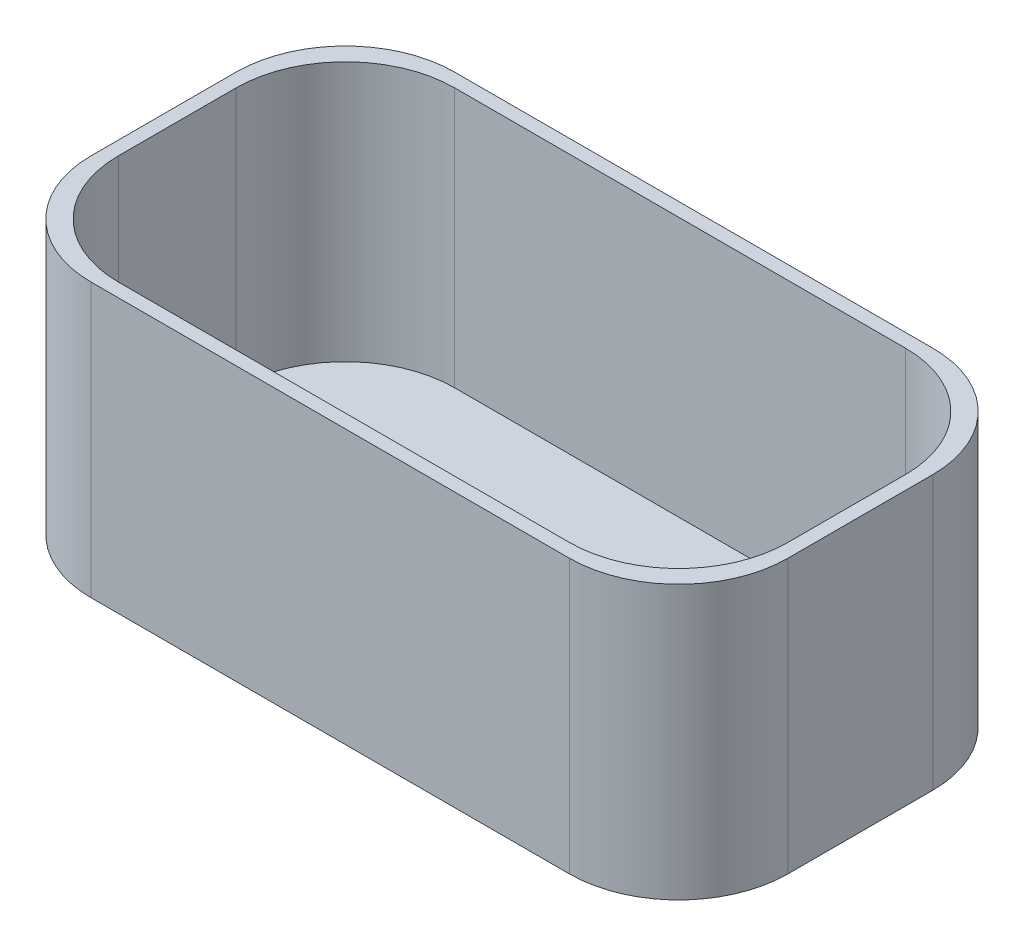
ISO-10303-21;
HEADER;
FILE_DESCRIPTION(('STEP AP214'),'2;1');
FILE_NAME('part.step','',(''),(''),'','','');
FILE_SCHEMA(('AUTOMOTIVE_DESIGN { 1 0 10303 214 1 1 1 1 }'));
ENDSEC;
DATA;
#1=APPLICATION_CONTEXT('core data for automotive mechanical design processes');
#2=APPLICATION_PROTOCOL_DEFINITION('international standard','automotive_design',2000,#1);
#3=PRODUCT_CONTEXT('',#1,'mechanical');
#4=PRODUCT('Part','Part','',(#3));
#5=PRODUCT_RELATED_PRODUCT_CATEGORY('part','',(#4));
#6=PRODUCT_DEFINITION_FORMATION('','',#4);
#7=PRODUCT_DEFINITION_CONTEXT('part definition',#1,'design');
#8=PRODUCT_DEFINITION('design','',#6,#7);
#9=PRODUCT_DEFINITION_SHAPE('','',#8);
#10=(LENGTH_UNIT() NAMED_UNIT(*) SI_UNIT(.MILLI.,.METRE.));
#11=(NAMED_UNIT(*) PLANE_ANGLE_UNIT() SI_UNIT($,.RADIAN.));
#12=(NAMED_UNIT(*) SI_UNIT($,.STERADIAN.) SOLID_ANGLE_UNIT());
#13=UNCERTAINTY_MEASURE_WITH_UNIT(LENGTH_MEASURE(1.E-05),#10,'distance_accuracy_value','');
#14=(GEOMETRIC_REPRESENTATION_CONTEXT(3) GLOBAL_UNCERTAINTY_ASSIGNED_CONTEXT((#13)) GLOBAL_UNIT_ASSIGNED_CONTEXT((#10,
#11,#12)) REPRESENTATION_CONTEXT('',''));
#15=CARTESIAN_POINT('',(0.,0.,0.));
#16=DIRECTION('',(0.,0.,1.));
#17=DIRECTION('',(1.,0.,0.));
#18=AXIS2_PLACEMENT_3D('',#15,#16,#17);
#19=CARTESIAN_POINT('',(127.45,100.,-66.5));
#20=DIRECTION('',(-1.,0.,0.));
#21=DIRECTION('',(0.,0.,1.));
#22=AXIS2_PLACEMENT_3D('',#19,#20,#21);
#23=PLANE('',#22);
#24=DIRECTION('',(0.,0.,-1.));
#25=VECTOR('',#24,1.);
#26=CARTESIAN_POINT('',(127.45,0.,-66.5));
#27=LINE('',#26,#25);
#28=CARTESIAN_POINT('',(127.45,0.,26.5));
#29=VERTEX_POINT('',#28);
#30=CARTESIAN_POINT('',(127.45,0.,-26.5));
#31=VERTEX_POINT('',#30);
#32=EDGE_CURVE('E223',#29,#31,#27,.T.);
#33=ORIENTED_EDGE('',*,*,#32,.T.);
#34=DIRECTION('',(0.,-1.,0.));
#35=VECTOR('',#34,1.);
#36=CARTESIAN_POINT('',(127.45,100.,-26.5));
#37=LINE('',#36,#35);
#38=CARTESIAN_POINT('',(127.45,100.,-26.5));
#39=VERTEX_POINT('',#38);
#40=EDGE_CURVE('E312',#31,#39,#37,.F.);
#41=ORIENTED_EDGE('',*,*,#40,.T.);
#42=DIRECTION('',(0.,0.,-1.));
#43=VECTOR('',#42,1.);
#44=CARTESIAN_POINT('',(127.45,100.,-66.5));
#45=LINE('',#44,#43);
#46=CARTESIAN_POINT('',(127.45,100.,26.5));
#47=VERTEX_POINT('',#46);
#48=EDGE_CURVE('E224',#47,#39,#45,.T.);
#49=ORIENTED_EDGE('',*,*,#48,.F.);
#50=DIRECTION('',(0.,-1.,0.));
#51=VECTOR('',#50,1.);
#52=CARTESIAN_POINT('',(127.45,100.,26.5));
#53=LINE('',#52,#51);
#54=EDGE_CURVE('E309',#47,#29,#53,.T.);
#55=ORIENTED_EDGE('',*,*,#54,.T.);
#56=EDGE_LOOP('',(#33,#41,#49,#55));
#57=FACE_BOUND('',#56,.T.);
#58=ADVANCED_FACE('F34',(#57),#23,.F.);
#59=CARTESIAN_POINT('',(-127.45,100.,-66.5));
#60=DIRECTION('',(0.,0.,1.));
#61=DIRECTION('',(1.,0.,0.));
#62=AXIS2_PLACEMENT_3D('',#59,#60,#61);
#63=PLANE('',#62);
#64=DIRECTION('',(-1.,0.,0.));
#65=VECTOR('',#64,1.);
#66=CARTESIAN_POINT('',(-127.45,0.,-66.5));
#67=LINE('',#66,#65);
#68=CARTESIAN_POINT('',(87.45,0.,-66.5));
#69=VERTEX_POINT('',#68);
#70=CARTESIAN_POINT('',(-87.45,0.,-66.5));
#71=VERTEX_POINT('',#70);
#72=EDGE_CURVE('E240',#69,#71,#67,.T.);
#73=ORIENTED_EDGE('',*,*,#72,.T.);
#74=DIRECTION('',(0.,-1.,0.));
#75=VECTOR('',#74,1.);
#76=CARTESIAN_POINT('',(-87.45,100.,-66.5));
#77=LINE('',#76,#75);
#78=CARTESIAN_POINT('',(-87.45,100.,-66.5));
#79=VERTEX_POINT('',#78);
#80=EDGE_CURVE('E299',#71,#79,#77,.F.);
#81=ORIENTED_EDGE('',*,*,#80,.T.);
#82=DIRECTION('',(-1.,0.,0.));
#83=VECTOR('',#82,1.);
#84=CARTESIAN_POINT('',(-127.45,100.,-66.5));
#85=LINE('',#84,#83);
#86=CARTESIAN_POINT('',(87.45,100.,-66.5));
#87=VERTEX_POINT('',#86);
#88=EDGE_CURVE('E227',#87,#79,#85,.T.);
#89=ORIENTED_EDGE('',*,*,#88,.F.);
#90=DIRECTION('',(0.,-1.,0.));
#91=VECTOR('',#90,1.);
#92=CARTESIAN_POINT('',(87.45,100.,-66.5));
#93=LINE('',#92,#91);
#94=EDGE_CURVE('E296',#87,#69,#93,.T.);
#95=ORIENTED_EDGE('',*,*,#94,.T.);
#96=EDGE_LOOP('',(#73,#81,#89,#95));
#97=FACE_BOUND('',#96,.T.);
#98=ADVANCED_FACE('F338',(#97),#63,.F.);
#99=CARTESIAN_POINT('',(-127.45,100.,-66.5));
#100=DIRECTION('',(1.,0.,0.));
#101=DIRECTION('',(0.,0.,-1.));
#102=AXIS2_PLACEMENT_3D('',#99,#100,#101);
#103=PLANE('',#102);
#104=DIRECTION('',(0.,0.,1.));
#105=VECTOR('',#104,1.);
#106=CARTESIAN_POINT('',(-127.45,100.,-66.5));
#107=LINE('',#106,#105);
#108=CARTESIAN_POINT('',(-127.45,100.,-26.5));
#109=VERTEX_POINT('',#108);
#110=CARTESIAN_POINT('',(-127.45,100.,26.5));
#111=VERTEX_POINT('',#110);
#112=EDGE_CURVE('E231',#109,#111,#107,.T.);
#113=ORIENTED_EDGE('',*,*,#112,.F.);
#114=DIRECTION('',(0.,-1.,0.));
#115=VECTOR('',#114,1.);
#116=CARTESIAN_POINT('',(-127.45,100.,-26.5));
#117=LINE('',#116,#115);
#118=CARTESIAN_POINT('',(-127.45,0.,-26.5));
#119=VERTEX_POINT('',#118);
#120=EDGE_CURVE('E285',#109,#119,#117,.T.);
#121=ORIENTED_EDGE('',*,*,#120,.T.);
#122=DIRECTION('',(0.,0.,1.));
#123=VECTOR('',#122,1.);
#124=CARTESIAN_POINT('',(-127.45,0.,-66.5));
#125=LINE('',#124,#123);
#126=CARTESIAN_POINT('',(-127.45,0.,26.5));
#127=VERTEX_POINT('',#126);
#128=EDGE_CURVE('E243',#119,#127,#125,.T.);
#129=ORIENTED_EDGE('',*,*,#128,.T.);
#130=DIRECTION('',(0.,-1.,0.));
#131=VECTOR('',#130,1.);
#132=CARTESIAN_POINT('',(-127.45,100.,26.5));
#133=LINE('',#132,#131);
#134=EDGE_CURVE('E283',#127,#111,#133,.F.);
#135=ORIENTED_EDGE('',*,*,#134,.T.);
#136=EDGE_LOOP('',(#113,#121,#129,#135));
#137=FACE_BOUND('',#136,.T.);
#138=ADVANCED_FACE('F344',(#137),#103,.F.);
#139=CARTESIAN_POINT('',(-127.45,100.,66.5));
#140=DIRECTION('',(0.,0.,-1.));
#141=DIRECTION('',(-1.,0.,0.));
#142=AXIS2_PLACEMENT_3D('',#139,#140,#141);
#143=PLANE('',#142);
#144=DIRECTION('',(1.,0.,0.));
#145=VECTOR('',#144,1.);
#146=CARTESIAN_POINT('',(-127.45,0.,66.5));
#147=LINE('',#146,#145);
#148=CARTESIAN_POINT('',(-87.45,0.,66.5));
#149=VERTEX_POINT('',#148);
#150=CARTESIAN_POINT('',(87.45,0.,66.5));
#151=VERTEX_POINT('',#150);
#152=EDGE_CURVE('E228',#149,#151,#147,.T.);
#153=ORIENTED_EDGE('',*,*,#152,.T.);
#154=DIRECTION('',(0.,-1.,0.));
#155=VECTOR('',#154,1.);
#156=CARTESIAN_POINT('',(87.45,100.,66.5));
#157=LINE('',#156,#155);
#158=CARTESIAN_POINT('',(87.45,100.,66.5));
#159=VERTEX_POINT('',#158);
#160=EDGE_CURVE('E317',#151,#159,#157,.F.);
#161=ORIENTED_EDGE('',*,*,#160,.T.);
#162=DIRECTION('',(1.,0.,0.));
#163=VECTOR('',#162,1.);
#164=CARTESIAN_POINT('',(-127.45,100.,66.5));
#165=LINE('',#164,#163);
#166=CARTESIAN_POINT('',(-87.45,100.,66.5));
#167=VERTEX_POINT('',#166);
#168=EDGE_CURVE('E234',#167,#159,#165,.T.);
#169=ORIENTED_EDGE('',*,*,#168,.F.);
#170=DIRECTION('',(0.,-1.,0.));
#171=VECTOR('',#170,1.);
#172=CARTESIAN_POINT('',(-87.45,100.,66.5));
#173=LINE('',#172,#171);
#174=EDGE_CURVE('E314',#167,#149,#173,.T.);
#175=ORIENTED_EDGE('',*,*,#174,.T.);
#176=EDGE_LOOP('',(#153,#161,#169,#175));
#177=FACE_BOUND('',#176,.T.);
#178=ADVANCED_FACE('F402',(#177),#143,.F.);
#179=CARTESIAN_POINT('',(0.,100.,0.));
#180=DIRECTION('',(0.,1.,0.));
#181=DIRECTION('',(0.,0.,1.));
#182=AXIS2_PLACEMENT_3D('',#179,#180,#181);
#183=PLANE('',#182);
#184=DIRECTION('',(0.,0.,-1.));
#185=VECTOR('',#184,1.);
#186=CARTESIAN_POINT('',(122.45,100.,-66.5));
#187=LINE('',#186,#185);
#188=CARTESIAN_POINT('',(122.45,100.,21.5));
#189=VERTEX_POINT('',#188);
#190=CARTESIAN_POINT('',(122.45,100.,-21.5));
#191=VERTEX_POINT('',#190);
#192=EDGE_CURVE('E211',#189,#191,#187,.T.);
#193=ORIENTED_EDGE('',*,*,#192,.F.);
#194=CARTESIAN_POINT('',(82.45,100.,21.5));
#195=DIRECTION('',(0.,1.,0.));
#196=DIRECTION('',(0.,0.,1.));
#197=AXIS2_PLACEMENT_3D('',#194,#195,#196);
#198=CIRCLE('',#197,40.);
#199=CARTESIAN_POINT('',(82.45,100.,61.5));
#200=VERTEX_POINT('',#199);
#201=EDGE_CURVE('E275',#189,#200,#198,.F.);
#202=ORIENTED_EDGE('',*,*,#201,.T.);
#203=DIRECTION('',(1.,0.,0.));
#204=VECTOR('',#203,1.);
#205=CARTESIAN_POINT('',(-127.45,100.,61.5));
#206=LINE('',#205,#204);
#207=CARTESIAN_POINT('',(-82.45,100.,61.5));
#208=VERTEX_POINT('',#207);
#209=EDGE_CURVE('E220',#208,#200,#206,.T.);
#210=ORIENTED_EDGE('',*,*,#209,.F.);
#211=CARTESIAN_POINT('',(-82.45,100.,21.5));
#212=DIRECTION('',(0.,1.,0.));
#213=DIRECTION('',(0.,0.,1.));
#214=AXIS2_PLACEMENT_3D('',#211,#212,#213);
#215=CIRCLE('',#214,40.);
#216=CARTESIAN_POINT('',(-122.45,100.,21.5));
#217=VERTEX_POINT('',#216);
#218=EDGE_CURVE('E281',#208,#217,#215,.F.);
#219=ORIENTED_EDGE('',*,*,#218,.T.);
#220=DIRECTION('',(0.,0.,1.));
#221=VECTOR('',#220,1.);
#222=CARTESIAN_POINT('',(-122.45,100.,-66.5));
#223=LINE('',#222,#221);
#224=CARTESIAN_POINT('',(-122.45,100.,-21.5));
#225=VERTEX_POINT('',#224);
#226=EDGE_CURVE('E217',#225,#217,#223,.T.);
#227=ORIENTED_EDGE('',*,*,#226,.F.);
#228=CARTESIAN_POINT('',(-82.45,100.,-21.5));
#229=DIRECTION('',(0.,1.,0.));
#230=DIRECTION('',(0.,0.,1.));
#231=AXIS2_PLACEMENT_3D('',#228,#229,#230);
#232=CIRCLE('',#231,40.);
#233=CARTESIAN_POINT('',(-82.45,100.,-61.5));
#234=VERTEX_POINT('',#233);
#235=EDGE_CURVE('E279',#225,#234,#232,.F.);
#236=ORIENTED_EDGE('',*,*,#235,.T.);
#237=DIRECTION('',(-1.,0.,0.));
#238=VECTOR('',#237,1.);
#239=CARTESIAN_POINT('',(-127.45,100.,-61.5));
#240=LINE('',#239,#238);
#241=CARTESIAN_POINT('',(82.45,100.,-61.5));
#242=VERTEX_POINT('',#241);
#243=EDGE_CURVE('E214',#242,#234,#240,.T.);
#244=ORIENTED_EDGE('',*,*,#243,.F.);
#245=CARTESIAN_POINT('',(82.45,100.,-21.5));
#246=DIRECTION('',(0.,1.,0.));
#247=DIRECTION('',(0.,0.,1.));
#248=AXIS2_PLACEMENT_3D('',#245,#246,#247);
#249=CIRCLE('',#248,40.);
#250=EDGE_CURVE('E277',#242,#191,#249,.F.);
#251=ORIENTED_EDGE('',*,*,#250,.T.);
#252=EDGE_LOOP('',(#193,#202,#210,#219,#227,#236,#244,#251));
#253=FACE_BOUND('',#252,.T.);
#254=ORIENTED_EDGE('',*,*,#88,.T.);
#255=CARTESIAN_POINT('',(-87.45,100.,-26.5));
#256=DIRECTION('',(0.,1.,0.));
#257=DIRECTION('',(0.,0.,1.));
#258=AXIS2_PLACEMENT_3D('',#255,#256,#257);
#259=CIRCLE('',#258,40.);
#260=EDGE_CURVE('E307',#79,#109,#259,.T.);
#261=ORIENTED_EDGE('',*,*,#260,.T.);
#262=ORIENTED_EDGE('',*,*,#112,.T.);
#263=CARTESIAN_POINT('',(-87.45,100.,26.5));
#264=DIRECTION('',(0.,1.,0.));
#265=DIRECTION('',(0.,0.,1.));
#266=AXIS2_PLACEMENT_3D('',#263,#264,#265);
#267=CIRCLE('',#266,40.);
#268=EDGE_CURVE('E301',#111,#167,#267,.T.);
#269=ORIENTED_EDGE('',*,*,#268,.T.);
#270=ORIENTED_EDGE('',*,*,#168,.T.);
#271=CARTESIAN_POINT('',(87.45,100.,26.5));
#272=DIRECTION('',(0.,1.,0.));
#273=DIRECTION('',(0.,0.,1.));
#274=AXIS2_PLACEMENT_3D('',#271,#272,#273);
#275=CIRCLE('',#274,40.);
#276=EDGE_CURVE('E303',#159,#47,#275,.T.);
#277=ORIENTED_EDGE('',*,*,#276,.T.);
#278=ORIENTED_EDGE('',*,*,#48,.T.);
#279=CARTESIAN_POINT('',(87.45,100.,-26.5));
#280=DIRECTION('',(0.,1.,0.));
#281=DIRECTION('',(0.,0.,1.));
#282=AXIS2_PLACEMENT_3D('',#279,#280,#281);
#283=CIRCLE('',#282,40.);
#284=EDGE_CURVE('E305',#39,#87,#283,.T.);
#285=ORIENTED_EDGE('',*,*,#284,.T.);
#286=EDGE_LOOP('',(#254,#261,#262,#269,#270,#277,#278,#285));
#287=FACE_BOUND('',#286,.T.);
#288=ADVANCED_FACE('F384',(#253,#287),#183,.T.);
#289=CARTESIAN_POINT('',(0.,0.,0.));
#290=DIRECTION('',(0.,1.,0.));
#291=DIRECTION('',(0.,0.,1.));
#292=AXIS2_PLACEMENT_3D('',#289,#290,#291);
#293=PLANE('',#292);
#294=DIRECTION('',(-1.,0.,0.));
#295=VECTOR('',#294,1.);
#296=CARTESIAN_POINT('',(0.,0.,-17.5));
#297=LINE('',#296,#295);
#298=CARTESIAN_POINT('',(25.,0.,-17.5));
#299=VERTEX_POINT('',#298);
#300=CARTESIAN_POINT('',(-25.,0.,-17.5));
#301=VERTEX_POINT('',#300);
#302=EDGE_CURVE('E42',#299,#301,#297,.T.);
#303=ORIENTED_EDGE('',*,*,#302,.T.);
#304=CARTESIAN_POINT('',(-25.,0.,0.));
#305=DIRECTION('',(0.,1.,0.));
#306=DIRECTION('',(0.,0.,1.));
#307=AXIS2_PLACEMENT_3D('',#304,#305,#306);
#308=CIRCLE('',#307,17.5);
#309=CARTESIAN_POINT('',(-25.,0.,17.5));
#310=VERTEX_POINT('',#309);
#311=EDGE_CURVE('E11',#301,#310,#308,.T.);
#312=ORIENTED_EDGE('',*,*,#311,.T.);
#313=DIRECTION('',(1.,0.,0.));
#314=VECTOR('',#313,1.);
#315=CARTESIAN_POINT('',(0.,0.,17.5));
#316=LINE('',#315,#314);
#317=CARTESIAN_POINT('',(25.,0.,17.5));
#318=VERTEX_POINT('',#317);
#319=EDGE_CURVE('E176',#310,#318,#316,.T.);
#320=ORIENTED_EDGE('',*,*,#319,.T.);
#321=CARTESIAN_POINT('',(25.,0.,0.));
#322=DIRECTION('',(0.,1.,0.));
#323=DIRECTION('',(0.,0.,1.));
#324=AXIS2_PLACEMENT_3D('',#321,#322,#323);
#325=CIRCLE('',#324,17.5);
#326=EDGE_CURVE('E320',#318,#299,#325,.T.);
#327=ORIENTED_EDGE('',*,*,#326,.T.);
#328=EDGE_LOOP('',(#303,#312,#320,#327));
#329=FACE_BOUND('',#328,.T.);
#330=ORIENTED_EDGE('',*,*,#128,.F.);
#331=CARTESIAN_POINT('',(-87.45,0.,-26.5));
#332=DIRECTION('',(0.,1.,0.));
#333=DIRECTION('',(0.,0.,1.));
#334=AXIS2_PLACEMENT_3D('',#331,#332,#333);
#335=CIRCLE('',#334,40.);
#336=EDGE_CURVE('E294',#119,#71,#335,.F.);
#337=ORIENTED_EDGE('',*,*,#336,.T.);
#338=ORIENTED_EDGE('',*,*,#72,.F.);
#339=CARTESIAN_POINT('',(87.45,0.,-26.5));
#340=DIRECTION('',(0.,1.,0.));
#341=DIRECTION('',(0.,0.,1.));
#342=AXIS2_PLACEMENT_3D('',#339,#340,#341);
#343=CIRCLE('',#342,40.);
#344=EDGE_CURVE('E292',#69,#31,#343,.F.);
#345=ORIENTED_EDGE('',*,*,#344,.T.);
#346=ORIENTED_EDGE('',*,*,#32,.F.);
#347=CARTESIAN_POINT('',(87.45,0.,26.5));
#348=DIRECTION('',(0.,1.,0.));
#349=DIRECTION('',(0.,0.,1.));
#350=AXIS2_PLACEMENT_3D('',#347,#348,#349);
#351=CIRCLE('',#350,40.);
#352=EDGE_CURVE('E290',#29,#151,#351,.F.);
#353=ORIENTED_EDGE('',*,*,#352,.T.);
#354=ORIENTED_EDGE('',*,*,#152,.F.);
#355=CARTESIAN_POINT('',(-87.45,0.,26.5));
#356=DIRECTION('',(0.,1.,0.));
#357=DIRECTION('',(0.,0.,1.));
#358=AXIS2_PLACEMENT_3D('',#355,#356,#357);
#359=CIRCLE('',#358,40.);
#360=EDGE_CURVE('E288',#149,#127,#359,.F.);
#361=ORIENTED_EDGE('',*,*,#360,.T.);
#362=EDGE_LOOP('',(#330,#337,#338,#345,#346,#353,#354,#361));
#363=FACE_BOUND('',#362,.T.);
#364=ADVANCED_FACE('F324',(#329,#363),#293,.F.);
#365=CARTESIAN_POINT('',(122.45,100.,-66.5));
#366=DIRECTION('',(-1.,0.,0.));
#367=DIRECTION('',(0.,0.,1.));
#368=AXIS2_PLACEMENT_3D('',#365,#366,#367);
#369=PLANE('',#368);
#370=DIRECTION('',(0.,0.,-1.));
#371=VECTOR('',#370,1.);
#372=CARTESIAN_POINT('',(122.45,5.,-66.5));
#373=LINE('',#372,#371);
#374=CARTESIAN_POINT('',(122.45,5.,21.5));
#375=VERTEX_POINT('',#374);
#376=CARTESIAN_POINT('',(122.45,5.,-21.5));
#377=VERTEX_POINT('',#376);
#378=EDGE_CURVE('E196',#375,#377,#373,.T.);
#379=ORIENTED_EDGE('',*,*,#378,.F.);
#380=DIRECTION('',(0.,-1.,0.));
#381=VECTOR('',#380,1.);
#382=CARTESIAN_POINT('',(122.45,100.,21.5));
#383=LINE('',#382,#381);
#384=EDGE_CURVE('E263',#375,#189,#383,.F.);
#385=ORIENTED_EDGE('',*,*,#384,.T.);
#386=ORIENTED_EDGE('',*,*,#192,.T.);
#387=DIRECTION('',(0.,-1.,0.));
#388=VECTOR('',#387,1.);
#389=CARTESIAN_POINT('',(122.45,5.,-21.5));
#390=LINE('',#389,#388);
#391=EDGE_CURVE('E260',#191,#377,#390,.T.);
#392=ORIENTED_EDGE('',*,*,#391,.T.);
#393=EDGE_LOOP('',(#379,#385,#386,#392));
#394=FACE_BOUND('',#393,.T.);
#395=ADVANCED_FACE('F405',(#394),#369,.T.);
#396=CARTESIAN_POINT('',(-127.45,100.,-61.5));
#397=DIRECTION('',(0.,0.,1.));
#398=DIRECTION('',(1.,0.,0.));
#399=AXIS2_PLACEMENT_3D('',#396,#397,#398);
#400=PLANE('',#399);
#401=DIRECTION('',(-1.,0.,0.));
#402=VECTOR('',#401,1.);
#403=CARTESIAN_POINT('',(-127.45,5.,-61.5));
#404=LINE('',#403,#402);
#405=CARTESIAN_POINT('',(82.45,5.,-61.5));
#406=VERTEX_POINT('',#405);
#407=CARTESIAN_POINT('',(-82.45,5.,-61.5));
#408=VERTEX_POINT('',#407);
#409=EDGE_CURVE('E202',#406,#408,#404,.T.);
#410=ORIENTED_EDGE('',*,*,#409,.F.);
#411=DIRECTION('',(0.,-1.,0.));
#412=VECTOR('',#411,1.);
#413=CARTESIAN_POINT('',(82.45,100.,-61.5));
#414=LINE('',#413,#412);
#415=EDGE_CURVE('E268',#406,#242,#414,.F.);
#416=ORIENTED_EDGE('',*,*,#415,.T.);
#417=ORIENTED_EDGE('',*,*,#243,.T.);
#418=DIRECTION('',(0.,-1.,0.));
#419=VECTOR('',#418,1.);
#420=CARTESIAN_POINT('',(-82.45,5.,-61.5));
#421=LINE('',#420,#419);
#422=EDGE_CURVE('E265',#234,#408,#421,.T.);
#423=ORIENTED_EDGE('',*,*,#422,.T.);
#424=EDGE_LOOP('',(#410,#416,#417,#423));
#425=FACE_BOUND('',#424,.T.);
#426=ADVANCED_FACE('F411',(#425),#400,.T.);
#427=CARTESIAN_POINT('',(-122.45,100.,-66.5));
#428=DIRECTION('',(1.,0.,0.));
#429=DIRECTION('',(0.,0.,-1.));
#430=AXIS2_PLACEMENT_3D('',#427,#428,#429);
#431=PLANE('',#430);
#432=DIRECTION('',(0.,0.,1.));
#433=VECTOR('',#432,1.);
#434=CARTESIAN_POINT('',(-122.45,5.,-66.5));
#435=LINE('',#434,#433);
#436=CARTESIAN_POINT('',(-122.45,5.,-21.5));
#437=VERTEX_POINT('',#436);
#438=CARTESIAN_POINT('',(-122.45,5.,21.5));
#439=VERTEX_POINT('',#438);
#440=EDGE_CURVE('E205',#437,#439,#435,.T.);
#441=ORIENTED_EDGE('',*,*,#440,.F.);
#442=DIRECTION('',(0.,-1.,0.));
#443=VECTOR('',#442,1.);
#444=CARTESIAN_POINT('',(-122.45,100.,-21.5));
#445=LINE('',#444,#443);
#446=EDGE_CURVE('E273',#437,#225,#445,.F.);
#447=ORIENTED_EDGE('',*,*,#446,.T.);
#448=ORIENTED_EDGE('',*,*,#226,.T.);
#449=DIRECTION('',(0.,-1.,0.));
#450=VECTOR('',#449,1.);
#451=CARTESIAN_POINT('',(-122.45,5.,21.5));
#452=LINE('',#451,#450);
#453=EDGE_CURVE('E270',#217,#439,#452,.T.);
#454=ORIENTED_EDGE('',*,*,#453,.T.);
#455=EDGE_LOOP('',(#441,#447,#448,#454));
#456=FACE_BOUND('',#455,.T.);
#457=ADVANCED_FACE('F502',(#456),#431,.T.);
#458=CARTESIAN_POINT('',(-127.45,100.,61.5));
#459=DIRECTION('',(0.,0.,-1.));
#460=DIRECTION('',(-1.,0.,0.));
#461=AXIS2_PLACEMENT_3D('',#458,#459,#460);
#462=PLANE('',#461);
#463=ORIENTED_EDGE('',*,*,#209,.T.);
#464=DIRECTION('',(0.,-1.,0.));
#465=VECTOR('',#464,1.);
#466=CARTESIAN_POINT('',(82.45,5.,61.5));
#467=LINE('',#466,#465);
#468=CARTESIAN_POINT('',(82.45,5.,61.5));
#469=VERTEX_POINT('',#468);
#470=EDGE_CURVE('E249',#200,#469,#467,.T.);
#471=ORIENTED_EDGE('',*,*,#470,.T.);
#472=DIRECTION('',(1.,0.,0.));
#473=VECTOR('',#472,1.);
#474=CARTESIAN_POINT('',(-127.45,5.,61.5));
#475=LINE('',#474,#473);
#476=CARTESIAN_POINT('',(-82.45,5.,61.5));
#477=VERTEX_POINT('',#476);
#478=EDGE_CURVE('E208',#477,#469,#475,.T.);
#479=ORIENTED_EDGE('',*,*,#478,.F.);
#480=DIRECTION('',(0.,-1.,0.));
#481=VECTOR('',#480,1.);
#482=CARTESIAN_POINT('',(-82.45,100.,61.5));
#483=LINE('',#482,#481);
#484=EDGE_CURVE('E237',#477,#208,#483,.F.);
#485=ORIENTED_EDGE('',*,*,#484,.T.);
#486=EDGE_LOOP('',(#463,#471,#479,#485));
#487=FACE_BOUND('',#486,.T.);
#488=ADVANCED_FACE('F471',(#487),#462,.T.);
#489=CARTESIAN_POINT('',(0.,5.,0.));
#490=DIRECTION('',(0.,1.,0.));
#491=DIRECTION('',(0.,0.,1.));
#492=AXIS2_PLACEMENT_3D('',#489,#490,#491);
#493=PLANE('',#492);
#494=CARTESIAN_POINT('',(-25.,5.,0.));
#495=DIRECTION('',(0.,1.,0.));
#496=DIRECTION('',(0.,0.,1.));
#497=AXIS2_PLACEMENT_3D('',#494,#495,#496);
#498=CIRCLE('',#497,17.5);
#499=CARTESIAN_POINT('',(-25.,5.,-17.5));
#500=VERTEX_POINT('',#499);
#501=CARTESIAN_POINT('',(-25.,5.,17.5));
#502=VERTEX_POINT('',#501);
#503=EDGE_CURVE('E181',#500,#502,#498,.T.);
#504=ORIENTED_EDGE('',*,*,#503,.F.);
#505=DIRECTION('',(-1.,0.,0.));
#506=VECTOR('',#505,1.);
#507=CARTESIAN_POINT('',(-25.,5.,-17.5));
#508=LINE('',#507,#506);
#509=CARTESIAN_POINT('',(25.,5.,-17.5));
#510=VERTEX_POINT('',#509);
#511=EDGE_CURVE('E178',#510,#500,#508,.T.);
#512=ORIENTED_EDGE('',*,*,#511,.F.);
#513=CARTESIAN_POINT('',(25.,5.,0.));
#514=DIRECTION('',(0.,1.,0.));
#515=DIRECTION('',(0.,0.,1.));
#516=AXIS2_PLACEMENT_3D('',#513,#514,#515);
#517=CIRCLE('',#516,17.5);
#518=CARTESIAN_POINT('',(25.,5.,17.5));
#519=VERTEX_POINT('',#518);
#520=EDGE_CURVE('E49',#519,#510,#517,.T.);
#521=ORIENTED_EDGE('',*,*,#520,.F.);
#522=DIRECTION('',(1.,0.,0.));
#523=VECTOR('',#522,1.);
#524=CARTESIAN_POINT('',(-25.,5.,17.5));
#525=LINE('',#524,#523);
#526=EDGE_CURVE('E174',#502,#519,#525,.T.);
#527=ORIENTED_EDGE('',*,*,#526,.F.);
#528=EDGE_LOOP('',(#504,#512,#521,#527));
#529=FACE_BOUND('',#528,.T.);
#530=ORIENTED_EDGE('',*,*,#478,.T.);
#531=CARTESIAN_POINT('',(82.45,5.,21.5));
#532=DIRECTION('',(0.,1.,0.));
#533=DIRECTION('',(0.,0.,1.));
#534=AXIS2_PLACEMENT_3D('',#531,#532,#533);
#535=CIRCLE('',#534,40.);
#536=EDGE_CURVE('E258',#469,#375,#535,.T.);
#537=ORIENTED_EDGE('',*,*,#536,.T.);
#538=ORIENTED_EDGE('',*,*,#378,.T.);
#539=CARTESIAN_POINT('',(82.45,5.,-21.5));
#540=DIRECTION('',(0.,1.,0.));
#541=DIRECTION('',(0.,0.,1.));
#542=AXIS2_PLACEMENT_3D('',#539,#540,#541);
#543=CIRCLE('',#542,40.);
#544=EDGE_CURVE('E256',#377,#406,#543,.T.);
#545=ORIENTED_EDGE('',*,*,#544,.T.);
#546=ORIENTED_EDGE('',*,*,#409,.T.);
#547=CARTESIAN_POINT('',(-82.45,5.,-21.5));
#548=DIRECTION('',(0.,1.,0.));
#549=DIRECTION('',(0.,0.,1.));
#550=AXIS2_PLACEMENT_3D('',#547,#548,#549);
#551=CIRCLE('',#550,40.);
#552=EDGE_CURVE('E254',#408,#437,#551,.T.);
#553=ORIENTED_EDGE('',*,*,#552,.T.);
#554=ORIENTED_EDGE('',*,*,#440,.T.);
#555=CARTESIAN_POINT('',(-82.45,5.,21.5));
#556=DIRECTION('',(0.,1.,0.));
#557=DIRECTION('',(0.,0.,1.));
#558=AXIS2_PLACEMENT_3D('',#555,#556,#557);
#559=CIRCLE('',#558,40.);
#560=EDGE_CURVE('E252',#439,#477,#559,.T.);
#561=ORIENTED_EDGE('',*,*,#560,.T.);
#562=EDGE_LOOP('',(#530,#537,#538,#545,#546,#553,#554,#561));
#563=FACE_BOUND('',#562,.T.);
#564=ADVANCED_FACE('F189',(#529,#563),#493,.T.);
#565=CARTESIAN_POINT('',(82.45,100.,21.5));
#566=DIRECTION('',(0.,1.,0.));
#567=DIRECTION('',(0.,0.,1.));
#568=AXIS2_PLACEMENT_3D('',#565,#566,#567);
#569=CYLINDRICAL_SURFACE('',#568,40.);
#570=ORIENTED_EDGE('',*,*,#201,.F.);
#571=ORIENTED_EDGE('',*,*,#384,.F.);
#572=ORIENTED_EDGE('',*,*,#536,.F.);
#573=ORIENTED_EDGE('',*,*,#470,.F.);
#574=EDGE_LOOP('',(#570,#571,#572,#573));
#575=FACE_BOUND('',#574,.T.);
#576=ADVANCED_FACE('F349',(#575),#569,.F.);
#577=CARTESIAN_POINT('',(82.45,100.,-21.5));
#578=DIRECTION('',(0.,1.,0.));
#579=DIRECTION('',(0.,0.,1.));
#580=AXIS2_PLACEMENT_3D('',#577,#578,#579);
#581=CYLINDRICAL_SURFACE('',#580,40.);
#582=ORIENTED_EDGE('',*,*,#250,.F.);
#583=ORIENTED_EDGE('',*,*,#415,.F.);
#584=ORIENTED_EDGE('',*,*,#544,.F.);
#585=ORIENTED_EDGE('',*,*,#391,.F.);
#586=EDGE_LOOP('',(#582,#583,#584,#585));
#587=FACE_BOUND('',#586,.T.);
#588=ADVANCED_FACE('F352',(#587),#581,.F.);
#589=CARTESIAN_POINT('',(-82.45,100.,-21.5));
#590=DIRECTION('',(0.,1.,0.));
#591=DIRECTION('',(0.,0.,1.));
#592=AXIS2_PLACEMENT_3D('',#589,#590,#591);
#593=CYLINDRICAL_SURFACE('',#592,40.);
#594=ORIENTED_EDGE('',*,*,#235,.F.);
#595=ORIENTED_EDGE('',*,*,#446,.F.);
#596=ORIENTED_EDGE('',*,*,#552,.F.);
#597=ORIENTED_EDGE('',*,*,#422,.F.);
#598=EDGE_LOOP('',(#594,#595,#596,#597));
#599=FACE_BOUND('',#598,.T.);
#600=ADVANCED_FACE('F356',(#599),#593,.F.);
#601=CARTESIAN_POINT('',(-82.45,100.,21.5));
#602=DIRECTION('',(0.,1.,0.));
#603=DIRECTION('',(0.,0.,1.));
#604=AXIS2_PLACEMENT_3D('',#601,#602,#603);
#605=CYLINDRICAL_SURFACE('',#604,40.);
#606=ORIENTED_EDGE('',*,*,#218,.F.);
#607=ORIENTED_EDGE('',*,*,#484,.F.);
#608=ORIENTED_EDGE('',*,*,#560,.F.);
#609=ORIENTED_EDGE('',*,*,#453,.F.);
#610=EDGE_LOOP('',(#606,#607,#608,#609));
#611=FACE_BOUND('',#610,.T.);
#612=ADVANCED_FACE('F360',(#611),#605,.F.);
#613=CARTESIAN_POINT('',(-87.45,100.,-26.5));
#614=DIRECTION('',(0.,-1.,0.));
#615=DIRECTION('',(0.,0.,-1.));
#616=AXIS2_PLACEMENT_3D('',#613,#614,#615);
#617=CYLINDRICAL_SURFACE('',#616,40.);
#618=ORIENTED_EDGE('',*,*,#260,.F.);
#619=ORIENTED_EDGE('',*,*,#80,.F.);
#620=ORIENTED_EDGE('',*,*,#336,.F.);
#621=ORIENTED_EDGE('',*,*,#120,.F.);
#622=EDGE_LOOP('',(#618,#619,#620,#621));
#623=FACE_BOUND('',#622,.T.);
#624=ADVANCED_FACE('F364',(#623),#617,.T.);
#625=CARTESIAN_POINT('',(87.45,100.,-26.5));
#626=DIRECTION('',(0.,-1.,0.));
#627=DIRECTION('',(0.,0.,-1.));
#628=AXIS2_PLACEMENT_3D('',#625,#626,#627);
#629=CYLINDRICAL_SURFACE('',#628,40.);
#630=ORIENTED_EDGE('',*,*,#284,.F.);
#631=ORIENTED_EDGE('',*,*,#40,.F.);
#632=ORIENTED_EDGE('',*,*,#344,.F.);
#633=ORIENTED_EDGE('',*,*,#94,.F.);
#634=EDGE_LOOP('',(#630,#631,#632,#633));
#635=FACE_BOUND('',#634,.T.);
#636=ADVANCED_FACE('F368',(#635),#629,.T.);
#637=CARTESIAN_POINT('',(87.45,100.,26.5));
#638=DIRECTION('',(0.,-1.,0.));
#639=DIRECTION('',(0.,0.,-1.));
#640=AXIS2_PLACEMENT_3D('',#637,#638,#639);
#641=CYLINDRICAL_SURFACE('',#640,40.);
#642=ORIENTED_EDGE('',*,*,#276,.F.);
#643=ORIENTED_EDGE('',*,*,#160,.F.);
#644=ORIENTED_EDGE('',*,*,#352,.F.);
#645=ORIENTED_EDGE('',*,*,#54,.F.);
#646=EDGE_LOOP('',(#642,#643,#644,#645));
#647=FACE_BOUND('',#646,.T.);
#648=ADVANCED_FACE('F371',(#647),#641,.T.);
#649=CARTESIAN_POINT('',(-87.45,100.,26.5));
#650=DIRECTION('',(0.,-1.,0.));
#651=DIRECTION('',(0.,0.,-1.));
#652=AXIS2_PLACEMENT_3D('',#649,#650,#651);
#653=CYLINDRICAL_SURFACE('',#652,40.);
#654=ORIENTED_EDGE('',*,*,#268,.F.);
#655=ORIENTED_EDGE('',*,*,#134,.F.);
#656=ORIENTED_EDGE('',*,*,#360,.F.);
#657=ORIENTED_EDGE('',*,*,#174,.F.);
#658=EDGE_LOOP('',(#654,#655,#656,#657));
#659=FACE_BOUND('',#658,.T.);
#660=ADVANCED_FACE('F36',(#659),#653,.T.);
#661=CARTESIAN_POINT('',(-25.,-95.,0.));
#662=DIRECTION('',(0.,1.,0.));
#663=DIRECTION('',(0.,0.,1.));
#664=AXIS2_PLACEMENT_3D('',#661,#662,#663);
#665=CYLINDRICAL_SURFACE('',#664,17.5);
#666=DIRECTION('',(0.,1.,0.));
#667=VECTOR('',#666,1.);
#668=CARTESIAN_POINT('',(-25.,-95.,-17.5));
#669=LINE('',#668,#667);
#670=EDGE_CURVE('E184',#301,#500,#669,.T.);
#671=ORIENTED_EDGE('',*,*,#670,.T.);
#672=ORIENTED_EDGE('',*,*,#503,.T.);
#673=DIRECTION('',(0.,1.,0.));
#674=VECTOR('',#673,1.);
#675=CARTESIAN_POINT('',(-25.,-95.,17.5));
#676=LINE('',#675,#674);
#677=EDGE_CURVE('E170',#310,#502,#676,.T.);
#678=ORIENTED_EDGE('',*,*,#677,.F.);
#679=ORIENTED_EDGE('',*,*,#311,.F.);
#680=EDGE_LOOP('',(#671,#672,#678,#679));
#681=FACE_BOUND('',#680,.T.);
#682=ADVANCED_FACE('F182',(#681),#665,.F.);
#683=CARTESIAN_POINT('',(-25.,-95.,-17.5));
#684=DIRECTION('',(0.,0.,-1.));
#685=DIRECTION('',(-1.,0.,0.));
#686=AXIS2_PLACEMENT_3D('',#683,#684,#685);
#687=PLANE('',#686);
#688=DIRECTION('',(0.,1.,0.));
#689=VECTOR('',#688,1.);
#690=CARTESIAN_POINT('',(25.,-95.,-17.5));
#691=LINE('',#690,#689);
#692=EDGE_CURVE('E197',#299,#510,#691,.T.);
#693=ORIENTED_EDGE('',*,*,#692,.T.);
#694=ORIENTED_EDGE('',*,*,#511,.T.);
#695=ORIENTED_EDGE('',*,*,#670,.F.);
#696=ORIENTED_EDGE('',*,*,#302,.F.);
#697=EDGE_LOOP('',(#693,#694,#695,#696));
#698=FACE_BOUND('',#697,.T.);
#699=ADVANCED_FACE('F327',(#698),#687,.F.);
#700=CARTESIAN_POINT('',(25.,-95.,0.));
#701=DIRECTION('',(0.,1.,0.));
#702=DIRECTION('',(0.,0.,1.));
#703=AXIS2_PLACEMENT_3D('',#700,#701,#702);
#704=CYLINDRICAL_SURFACE('',#703,17.5);
#705=DIRECTION('',(0.,1.,0.));
#706=VECTOR('',#705,1.);
#707=CARTESIAN_POINT('',(25.,-95.,17.5));
#708=LINE('',#707,#706);
#709=EDGE_CURVE('E56',#318,#519,#708,.T.);
#710=ORIENTED_EDGE('',*,*,#709,.T.);
#711=ORIENTED_EDGE('',*,*,#520,.T.);
#712=ORIENTED_EDGE('',*,*,#692,.F.);
#713=ORIENTED_EDGE('',*,*,#326,.F.);
#714=EDGE_LOOP('',(#710,#711,#712,#713));
#715=FACE_BOUND('',#714,.T.);
#716=ADVANCED_FACE('F328',(#715),#704,.F.);
#717=CARTESIAN_POINT('',(-25.,-95.,17.5));
#718=DIRECTION('',(0.,0.,1.));
#719=DIRECTION('',(1.,0.,0.));
#720=AXIS2_PLACEMENT_3D('',#717,#718,#719);
#721=PLANE('',#720);
#722=ORIENTED_EDGE('',*,*,#677,.T.);
#723=ORIENTED_EDGE('',*,*,#526,.T.);
#724=ORIENTED_EDGE('',*,*,#709,.F.);
#725=ORIENTED_EDGE('',*,*,#319,.F.);
#726=EDGE_LOOP('',(#722,#723,#724,#725));
#727=FACE_BOUND('',#726,.T.);
#728=ADVANCED_FACE('F172',(#727),#721,.F.);
#729=CLOSED_SHELL('',(#58,#98,#138,#178,#288,#364,#395,#426,#457,#488,#564,#576,#588,#600,#612,
#624,#636,#648,#660,#682,#699,#716,#728));
#730=MANIFOLD_SOLID_BREP('B2',#729);
#731=ADVANCED_BREP_SHAPE_REPRESENTATION('',(#18,#730),#14);
#732=SHAPE_DEFINITION_REPRESENTATION(#9,#731);
ENDSEC;
END-ISO-10303-21;
